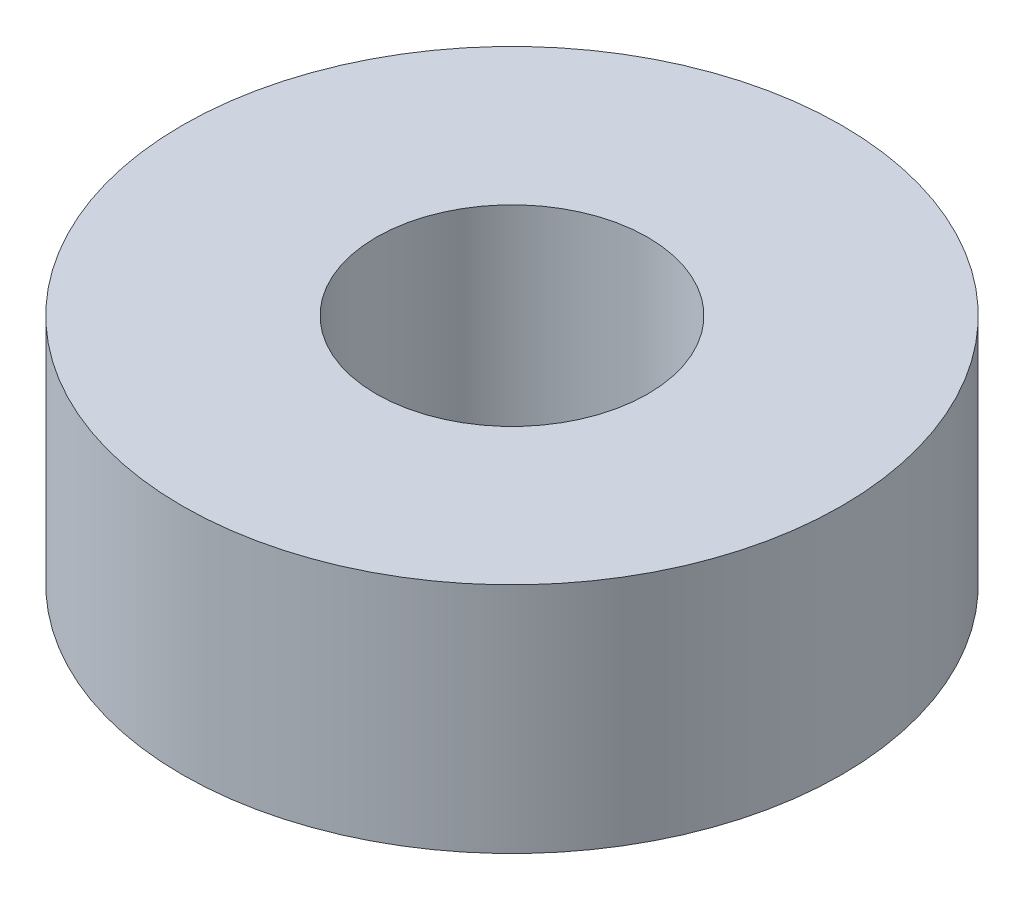
ISO-10303-21;
HEADER;
FILE_DESCRIPTION(('STEP AP214'),'2;1');
FILE_NAME('part.step','',(''),(''),'','','');
FILE_SCHEMA(('AUTOMOTIVE_DESIGN { 1 0 10303 214 1 1 1 1 }'));
ENDSEC;
DATA;
#1=APPLICATION_CONTEXT('core data for automotive mechanical design processes');
#2=APPLICATION_PROTOCOL_DEFINITION('international standard','automotive_design',2000,#1);
#3=PRODUCT_CONTEXT('',#1,'mechanical');
#4=PRODUCT('Part','Part','',(#3));
#5=PRODUCT_RELATED_PRODUCT_CATEGORY('part','',(#4));
#6=PRODUCT_DEFINITION_FORMATION('','',#4);
#7=PRODUCT_DEFINITION_CONTEXT('part definition',#1,'design');
#8=PRODUCT_DEFINITION('design','',#6,#7);
#9=PRODUCT_DEFINITION_SHAPE('','',#8);
#10=(LENGTH_UNIT() NAMED_UNIT(*) SI_UNIT(.MILLI.,.METRE.));
#11=(NAMED_UNIT(*) PLANE_ANGLE_UNIT() SI_UNIT($,.RADIAN.));
#12=(NAMED_UNIT(*) SI_UNIT($,.STERADIAN.) SOLID_ANGLE_UNIT());
#13=UNCERTAINTY_MEASURE_WITH_UNIT(LENGTH_MEASURE(1.E-05),#10,'distance_accuracy_value','');
#14=(GEOMETRIC_REPRESENTATION_CONTEXT(3) GLOBAL_UNCERTAINTY_ASSIGNED_CONTEXT((#13)) GLOBAL_UNIT_ASSIGNED_CONTEXT((#10,
#11,#12)) REPRESENTATION_CONTEXT('',''));
#15=CARTESIAN_POINT('',(0.,0.,0.));
#16=DIRECTION('',(0.,0.,1.));
#17=DIRECTION('',(1.,0.,0.));
#18=AXIS2_PLACEMENT_3D('',#15,#16,#17);
#19=CARTESIAN_POINT('',(0.,6.,0.));
#20=DIRECTION('',(0.,1.,0.));
#21=DIRECTION('',(0.,0.,1.));
#22=AXIS2_PLACEMENT_3D('',#19,#20,#21);
#23=PLANE('',#22);
#24=CARTESIAN_POINT('',(0.,6.,0.));
#25=DIRECTION('',(0.,1.,0.));
#26=DIRECTION('',(0.,0.,1.));
#27=AXIS2_PLACEMENT_3D('',#24,#25,#26);
#28=CIRCLE('',#27,8.5);
#29=CARTESIAN_POINT('',(0.,6.,8.5));
#30=VERTEX_POINT('',#29);
#31=EDGE_CURVE('E10',#30,#30,#28,.T.);
#32=ORIENTED_EDGE('',*,*,#31,.T.);
#33=EDGE_LOOP('',(#32));
#34=FACE_BOUND('',#33,.T.);
#35=CARTESIAN_POINT('',(0.,6.,0.));
#36=DIRECTION('',(0.,1.,0.));
#37=DIRECTION('',(0.,0.,1.));
#38=AXIS2_PLACEMENT_3D('',#35,#36,#37);
#39=CIRCLE('',#38,3.5);
#40=CARTESIAN_POINT('',(0.,6.,3.5));
#41=VERTEX_POINT('',#40);
#42=EDGE_CURVE('E44',#41,#41,#39,.T.);
#43=ORIENTED_EDGE('',*,*,#42,.F.);
#44=EDGE_LOOP('',(#43));
#45=FACE_BOUND('',#44,.T.);
#46=ADVANCED_FACE('F33',(#34,#45),#23,.T.);
#47=CARTESIAN_POINT('',(0.,0.,0.));
#48=DIRECTION('',(0.,1.,0.));
#49=DIRECTION('',(0.,0.,1.));
#50=AXIS2_PLACEMENT_3D('',#47,#48,#49);
#51=PLANE('',#50);
#52=CARTESIAN_POINT('',(0.,0.,0.));
#53=DIRECTION('',(0.,1.,0.));
#54=DIRECTION('',(0.,0.,1.));
#55=AXIS2_PLACEMENT_3D('',#52,#53,#54);
#56=CIRCLE('',#55,8.5);
#57=CARTESIAN_POINT('',(0.,0.,8.5));
#58=VERTEX_POINT('',#57);
#59=EDGE_CURVE('E37',#58,#58,#56,.T.);
#60=ORIENTED_EDGE('',*,*,#59,.F.);
#61=EDGE_LOOP('',(#60));
#62=FACE_BOUND('',#61,.T.);
#63=CARTESIAN_POINT('',(0.,0.,0.));
#64=DIRECTION('',(0.,1.,0.));
#65=DIRECTION('',(0.,0.,1.));
#66=AXIS2_PLACEMENT_3D('',#63,#64,#65);
#67=CIRCLE('',#66,3.5);
#68=CARTESIAN_POINT('',(0.,0.,3.5));
#69=VERTEX_POINT('',#68);
#70=EDGE_CURVE('E46',#69,#69,#67,.T.);
#71=ORIENTED_EDGE('',*,*,#70,.T.);
#72=EDGE_LOOP('',(#71));
#73=FACE_BOUND('',#72,.T.);
#74=ADVANCED_FACE('F56',(#62,#73),#51,.F.);
#75=CARTESIAN_POINT('',(0.,6.,0.));
#76=DIRECTION('',(0.,-1.,0.));
#77=DIRECTION('',(0.,0.,-1.));
#78=AXIS2_PLACEMENT_3D('',#75,#76,#77);
#79=CYLINDRICAL_SURFACE('',#78,8.5);
#80=ORIENTED_EDGE('',*,*,#31,.F.);
#81=EDGE_LOOP('',(#80));
#82=FACE_BOUND('',#81,.T.);
#83=ORIENTED_EDGE('',*,*,#59,.T.);
#84=EDGE_LOOP('',(#83));
#85=FACE_BOUND('',#84,.T.);
#86=ADVANCED_FACE('F35',(#82,#85),#79,.T.);
#87=CARTESIAN_POINT('',(0.,6.,0.));
#88=DIRECTION('',(0.,-1.,0.));
#89=DIRECTION('',(0.,0.,-1.));
#90=AXIS2_PLACEMENT_3D('',#87,#88,#89);
#91=CYLINDRICAL_SURFACE('',#90,3.5);
#92=ORIENTED_EDGE('',*,*,#42,.T.);
#93=EDGE_LOOP('',(#92));
#94=FACE_BOUND('',#93,.T.);
#95=ORIENTED_EDGE('',*,*,#70,.F.);
#96=EDGE_LOOP('',(#95));
#97=FACE_BOUND('',#96,.T.);
#98=ADVANCED_FACE('F52',(#94,#97),#91,.F.);
#99=CLOSED_SHELL('',(#46,#74,#86,#98));
#100=MANIFOLD_SOLID_BREP('B2',#99);
#101=ADVANCED_BREP_SHAPE_REPRESENTATION('',(#18,#100),#14);
#102=SHAPE_DEFINITION_REPRESENTATION(#9,#101);
ENDSEC;
END-ISO-10303-21;
